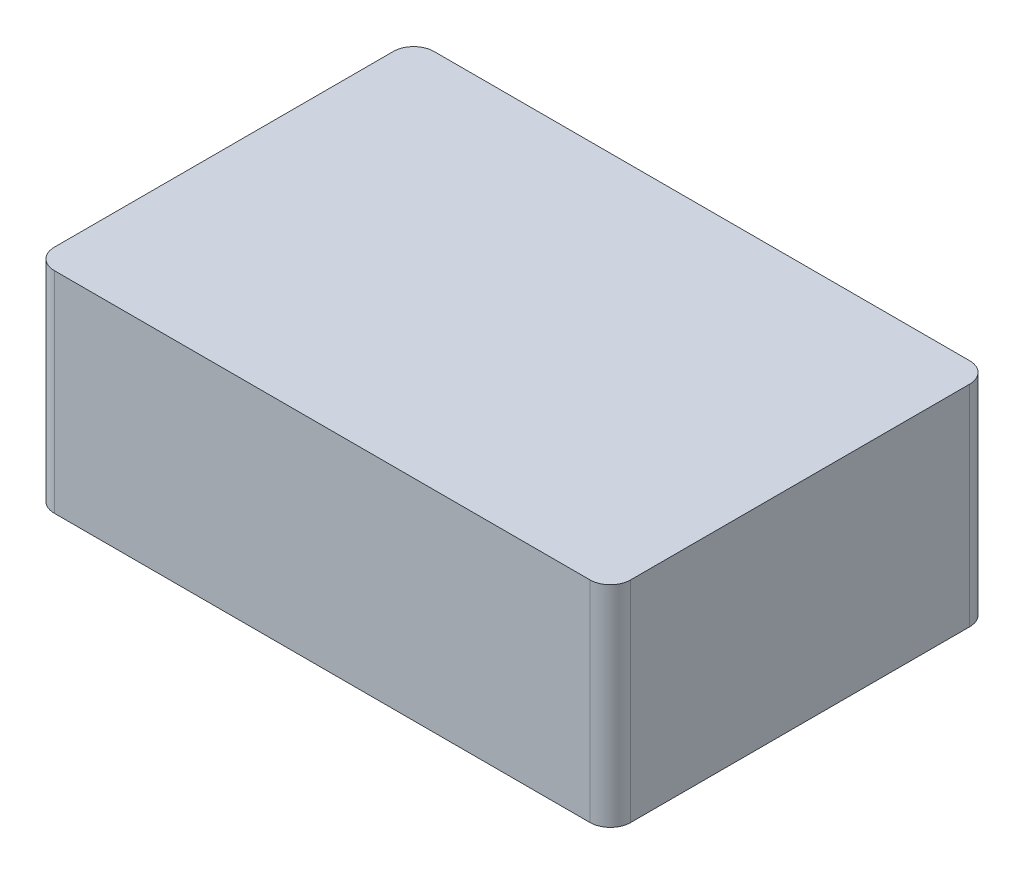
ISO-10303-21;
HEADER;
FILE_DESCRIPTION(('STEP AP214'),'2;1');
FILE_NAME('part.step','',(''),(''),'','','');
FILE_SCHEMA(('AUTOMOTIVE_DESIGN { 1 0 10303 214 1 1 1 1 }'));
ENDSEC;
DATA;
#1=APPLICATION_CONTEXT('core data for automotive mechanical design processes');
#2=APPLICATION_PROTOCOL_DEFINITION('international standard','automotive_design',2000,#1);
#3=PRODUCT_CONTEXT('',#1,'mechanical');
#4=PRODUCT('Part','Part','',(#3));
#5=PRODUCT_RELATED_PRODUCT_CATEGORY('part','',(#4));
#6=PRODUCT_DEFINITION_FORMATION('','',#4);
#7=PRODUCT_DEFINITION_CONTEXT('part definition',#1,'design');
#8=PRODUCT_DEFINITION('design','',#6,#7);
#9=PRODUCT_DEFINITION_SHAPE('','',#8);
#10=(LENGTH_UNIT() NAMED_UNIT(*) SI_UNIT(.MILLI.,.METRE.));
#11=(NAMED_UNIT(*) PLANE_ANGLE_UNIT() SI_UNIT($,.RADIAN.));
#12=(NAMED_UNIT(*) SI_UNIT($,.STERADIAN.) SOLID_ANGLE_UNIT());
#13=UNCERTAINTY_MEASURE_WITH_UNIT(LENGTH_MEASURE(1.E-05),#10,'distance_accuracy_value','');
#14=(GEOMETRIC_REPRESENTATION_CONTEXT(3) GLOBAL_UNCERTAINTY_ASSIGNED_CONTEXT((#13)) GLOBAL_UNIT_ASSIGNED_CONTEXT((#10,
#11,#12)) REPRESENTATION_CONTEXT('',''));
#15=CARTESIAN_POINT('',(0.,0.,0.));
#16=DIRECTION('',(0.,0.,1.));
#17=DIRECTION('',(1.,0.,0.));
#18=AXIS2_PLACEMENT_3D('',#15,#16,#17);
#19=CARTESIAN_POINT('',(0.,31.,0.));
#20=DIRECTION('',(1.,0.,0.));
#21=DIRECTION('',(0.,0.,-1.));
#22=AXIS2_PLACEMENT_3D('',#19,#20,#21);
#23=PLANE('',#22);
#24=DIRECTION('',(0.,0.,1.));
#25=VECTOR('',#24,1.);
#26=CARTESIAN_POINT('',(0.,31.,0.));
#27=LINE('',#26,#25);
#28=CARTESIAN_POINT('',(0.,31.,3.));
#29=VERTEX_POINT('',#28);
#30=CARTESIAN_POINT('',(0.,31.,53.));
#31=VERTEX_POINT('',#30);
#32=EDGE_CURVE('E126',#29,#31,#27,.T.);
#33=ORIENTED_EDGE('',*,*,#32,.F.);
#34=DIRECTION('',(0.,-1.,0.));
#35=VECTOR('',#34,1.);
#36=CARTESIAN_POINT('',(0.,31.,3.));
#37=LINE('',#36,#35);
#38=CARTESIAN_POINT('',(0.,0.,3.));
#39=VERTEX_POINT('',#38);
#40=EDGE_CURVE('E111',#29,#39,#37,.T.);
#41=ORIENTED_EDGE('',*,*,#40,.T.);
#42=DIRECTION('',(0.,0.,1.));
#43=VECTOR('',#42,1.);
#44=CARTESIAN_POINT('',(0.,0.,0.));
#45=LINE('',#44,#43);
#46=CARTESIAN_POINT('',(0.,0.,53.));
#47=VERTEX_POINT('',#46);
#48=EDGE_CURVE('E123',#39,#47,#45,.T.);
#49=ORIENTED_EDGE('',*,*,#48,.T.);
#50=DIRECTION('',(0.,-1.,0.));
#51=VECTOR('',#50,1.);
#52=CARTESIAN_POINT('',(0.,31.,53.));
#53=LINE('',#52,#51);
#54=EDGE_CURVE('E128',#47,#31,#53,.F.);
#55=ORIENTED_EDGE('',*,*,#54,.T.);
#56=EDGE_LOOP('',(#33,#41,#49,#55));
#57=FACE_BOUND('',#56,.T.);
#58=ADVANCED_FACE('F41',(#57),#23,.F.);
#59=CARTESIAN_POINT('',(0.,31.,56.));
#60=DIRECTION('',(0.,0.,-1.));
#61=DIRECTION('',(-1.,0.,0.));
#62=AXIS2_PLACEMENT_3D('',#59,#60,#61);
#63=PLANE('',#62);
#64=DIRECTION('',(1.,0.,0.));
#65=VECTOR('',#64,1.);
#66=CARTESIAN_POINT('',(0.,0.,56.));
#67=LINE('',#66,#65);
#68=CARTESIAN_POINT('',(3.00000000000001,0.,56.));
#69=VERTEX_POINT('',#68);
#70=CARTESIAN_POINT('',(82.,0.,56.));
#71=VERTEX_POINT('',#70);
#72=EDGE_CURVE('E132',#69,#71,#67,.T.);
#73=ORIENTED_EDGE('',*,*,#72,.T.);
#74=DIRECTION('',(0.,-1.,0.));
#75=VECTOR('',#74,1.);
#76=CARTESIAN_POINT('',(82.,31.,56.));
#77=LINE('',#76,#75);
#78=CARTESIAN_POINT('',(82.,31.,56.));
#79=VERTEX_POINT('',#78);
#80=EDGE_CURVE('E11',#71,#79,#77,.F.);
#81=ORIENTED_EDGE('',*,*,#80,.T.);
#82=DIRECTION('',(1.,0.,0.));
#83=VECTOR('',#82,1.);
#84=CARTESIAN_POINT('',(0.,31.,56.));
#85=LINE('',#84,#83);
#86=CARTESIAN_POINT('',(3.00000000000001,31.,56.));
#87=VERTEX_POINT('',#86);
#88=EDGE_CURVE('E168',#87,#79,#85,.T.);
#89=ORIENTED_EDGE('',*,*,#88,.F.);
#90=DIRECTION('',(0.,-1.,0.));
#91=VECTOR('',#90,1.);
#92=CARTESIAN_POINT('',(3.00000000000001,31.,56.));
#93=LINE('',#92,#91);
#94=EDGE_CURVE('E49',#87,#69,#93,.T.);
#95=ORIENTED_EDGE('',*,*,#94,.T.);
#96=EDGE_LOOP('',(#73,#81,#89,#95));
#97=FACE_BOUND('',#96,.T.);
#98=ADVANCED_FACE('F166',(#97),#63,.F.);
#99=CARTESIAN_POINT('',(85.,31.,0.));
#100=DIRECTION('',(-1.,0.,0.));
#101=DIRECTION('',(0.,0.,1.));
#102=AXIS2_PLACEMENT_3D('',#99,#100,#101);
#103=PLANE('',#102);
#104=DIRECTION('',(0.,0.,-1.));
#105=VECTOR('',#104,1.);
#106=CARTESIAN_POINT('',(85.,0.,0.));
#107=LINE('',#106,#105);
#108=CARTESIAN_POINT('',(85.,0.,53.));
#109=VERTEX_POINT('',#108);
#110=CARTESIAN_POINT('',(85.,0.,3.));
#111=VERTEX_POINT('',#110);
#112=EDGE_CURVE('E135',#109,#111,#107,.T.);
#113=ORIENTED_EDGE('',*,*,#112,.T.);
#114=DIRECTION('',(0.,-1.,0.));
#115=VECTOR('',#114,1.);
#116=CARTESIAN_POINT('',(85.,31.,3.));
#117=LINE('',#116,#115);
#118=CARTESIAN_POINT('',(85.,31.,3.));
#119=VERTEX_POINT('',#118);
#120=EDGE_CURVE('E56',#111,#119,#117,.F.);
#121=ORIENTED_EDGE('',*,*,#120,.T.);
#122=DIRECTION('',(0.,0.,-1.));
#123=VECTOR('',#122,1.);
#124=CARTESIAN_POINT('',(85.,31.,0.));
#125=LINE('',#124,#123);
#126=CARTESIAN_POINT('',(85.,31.,53.));
#127=VERTEX_POINT('',#126);
#128=EDGE_CURVE('E176',#127,#119,#125,.T.);
#129=ORIENTED_EDGE('',*,*,#128,.F.);
#130=DIRECTION('',(0.,-1.,0.));
#131=VECTOR('',#130,1.);
#132=CARTESIAN_POINT('',(85.,31.,53.));
#133=LINE('',#132,#131);
#134=EDGE_CURVE('E159',#127,#109,#133,.T.);
#135=ORIENTED_EDGE('',*,*,#134,.T.);
#136=EDGE_LOOP('',(#113,#121,#129,#135));
#137=FACE_BOUND('',#136,.T.);
#138=ADVANCED_FACE('F175',(#137),#103,.F.);
#139=CARTESIAN_POINT('',(0.,31.,0.));
#140=DIRECTION('',(0.,0.,1.));
#141=DIRECTION('',(1.,0.,0.));
#142=AXIS2_PLACEMENT_3D('',#139,#140,#141);
#143=PLANE('',#142);
#144=DIRECTION('',(-1.,0.,0.));
#145=VECTOR('',#144,1.);
#146=CARTESIAN_POINT('',(0.,0.,0.));
#147=LINE('',#146,#145);
#148=CARTESIAN_POINT('',(82.,0.,0.));
#149=VERTEX_POINT('',#148);
#150=CARTESIAN_POINT('',(3.,0.,0.));
#151=VERTEX_POINT('',#150);
#152=EDGE_CURVE('E142',#149,#151,#147,.T.);
#153=ORIENTED_EDGE('',*,*,#152,.T.);
#154=DIRECTION('',(0.,-1.,0.));
#155=VECTOR('',#154,1.);
#156=CARTESIAN_POINT('',(3.,31.,0.));
#157=LINE('',#156,#155);
#158=CARTESIAN_POINT('',(3.,31.,0.));
#159=VERTEX_POINT('',#158);
#160=EDGE_CURVE('E112',#151,#159,#157,.F.);
#161=ORIENTED_EDGE('',*,*,#160,.T.);
#162=DIRECTION('',(-1.,0.,0.));
#163=VECTOR('',#162,1.);
#164=CARTESIAN_POINT('',(0.,31.,0.));
#165=LINE('',#164,#163);
#166=CARTESIAN_POINT('',(82.,31.,0.));
#167=VERTEX_POINT('',#166);
#168=EDGE_CURVE('E138',#167,#159,#165,.T.);
#169=ORIENTED_EDGE('',*,*,#168,.F.);
#170=DIRECTION('',(0.,-1.,0.));
#171=VECTOR('',#170,1.);
#172=CARTESIAN_POINT('',(82.,31.,0.));
#173=LINE('',#172,#171);
#174=EDGE_CURVE('E117',#167,#149,#173,.T.);
#175=ORIENTED_EDGE('',*,*,#174,.T.);
#176=EDGE_LOOP('',(#153,#161,#169,#175));
#177=FACE_BOUND('',#176,.T.);
#178=ADVANCED_FACE('F204',(#177),#143,.F.);
#179=CARTESIAN_POINT('',(0.,31.,0.));
#180=DIRECTION('',(0.,1.,0.));
#181=DIRECTION('',(0.,0.,1.));
#182=AXIS2_PLACEMENT_3D('',#179,#180,#181);
#183=PLANE('',#182);
#184=ORIENTED_EDGE('',*,*,#168,.T.);
#185=CARTESIAN_POINT('',(3.,31.,3.));
#186=DIRECTION('',(0.,1.,0.));
#187=DIRECTION('',(0.,0.,1.));
#188=AXIS2_PLACEMENT_3D('',#185,#186,#187);
#189=CIRCLE('',#188,3.);
#190=EDGE_CURVE('E157',#159,#29,#189,.T.);
#191=ORIENTED_EDGE('',*,*,#190,.T.);
#192=ORIENTED_EDGE('',*,*,#32,.T.);
#193=CARTESIAN_POINT('',(3.00000000000001,31.,53.));
#194=DIRECTION('',(0.,1.,0.));
#195=DIRECTION('',(0.,0.,1.));
#196=AXIS2_PLACEMENT_3D('',#193,#194,#195);
#197=CIRCLE('',#196,3.);
#198=EDGE_CURVE('E152',#31,#87,#197,.T.);
#199=ORIENTED_EDGE('',*,*,#198,.T.);
#200=ORIENTED_EDGE('',*,*,#88,.T.);
#201=CARTESIAN_POINT('',(82.,31.,53.));
#202=DIRECTION('',(0.,1.,0.));
#203=DIRECTION('',(0.,0.,1.));
#204=AXIS2_PLACEMENT_3D('',#201,#202,#203);
#205=CIRCLE('',#204,3.);
#206=EDGE_CURVE('E63',#79,#127,#205,.T.);
#207=ORIENTED_EDGE('',*,*,#206,.T.);
#208=ORIENTED_EDGE('',*,*,#128,.T.);
#209=CARTESIAN_POINT('',(82.,31.,3.));
#210=DIRECTION('',(0.,1.,0.));
#211=DIRECTION('',(0.,0.,1.));
#212=AXIS2_PLACEMENT_3D('',#209,#210,#211);
#213=CIRCLE('',#212,3.);
#214=EDGE_CURVE('E155',#119,#167,#213,.T.);
#215=ORIENTED_EDGE('',*,*,#214,.T.);
#216=EDGE_LOOP('',(#184,#191,#192,#199,#200,#207,#208,#215));
#217=FACE_BOUND('',#216,.T.);
#218=ADVANCED_FACE('F181',(#217),#183,.T.);
#219=CARTESIAN_POINT('',(0.,0.,0.));
#220=DIRECTION('',(0.,1.,0.));
#221=DIRECTION('',(0.,0.,1.));
#222=AXIS2_PLACEMENT_3D('',#219,#220,#221);
#223=PLANE('',#222);
#224=ORIENTED_EDGE('',*,*,#48,.F.);
#225=CARTESIAN_POINT('',(3.,0.,3.));
#226=DIRECTION('',(0.,1.,0.));
#227=DIRECTION('',(0.,0.,1.));
#228=AXIS2_PLACEMENT_3D('',#225,#226,#227);
#229=CIRCLE('',#228,3.);
#230=EDGE_CURVE('E107',#39,#151,#229,.F.);
#231=ORIENTED_EDGE('',*,*,#230,.T.);
#232=ORIENTED_EDGE('',*,*,#152,.F.);
#233=CARTESIAN_POINT('',(82.,0.,3.));
#234=DIRECTION('',(0.,1.,0.));
#235=DIRECTION('',(0.,0.,1.));
#236=AXIS2_PLACEMENT_3D('',#233,#234,#235);
#237=CIRCLE('',#236,3.);
#238=EDGE_CURVE('E118',#149,#111,#237,.F.);
#239=ORIENTED_EDGE('',*,*,#238,.T.);
#240=ORIENTED_EDGE('',*,*,#112,.F.);
#241=CARTESIAN_POINT('',(82.,0.,53.));
#242=DIRECTION('',(0.,1.,0.));
#243=DIRECTION('',(0.,0.,1.));
#244=AXIS2_PLACEMENT_3D('',#241,#242,#243);
#245=CIRCLE('',#244,3.);
#246=EDGE_CURVE('E146',#109,#71,#245,.F.);
#247=ORIENTED_EDGE('',*,*,#246,.T.);
#248=ORIENTED_EDGE('',*,*,#72,.F.);
#249=CARTESIAN_POINT('',(3.00000000000001,0.,53.));
#250=DIRECTION('',(0.,1.,0.));
#251=DIRECTION('',(0.,0.,1.));
#252=AXIS2_PLACEMENT_3D('',#249,#250,#251);
#253=CIRCLE('',#252,3.);
#254=EDGE_CURVE('E127',#69,#47,#253,.F.);
#255=ORIENTED_EDGE('',*,*,#254,.T.);
#256=EDGE_LOOP('',(#224,#231,#232,#239,#240,#247,#248,#255));
#257=FACE_BOUND('',#256,.T.);
#258=ADVANCED_FACE('F130',(#257),#223,.F.);
#259=CARTESIAN_POINT('',(3.,31.,3.));
#260=DIRECTION('',(0.,-1.,0.));
#261=DIRECTION('',(0.,0.,-1.));
#262=AXIS2_PLACEMENT_3D('',#259,#260,#261);
#263=CYLINDRICAL_SURFACE('',#262,3.);
#264=ORIENTED_EDGE('',*,*,#190,.F.);
#265=ORIENTED_EDGE('',*,*,#160,.F.);
#266=ORIENTED_EDGE('',*,*,#230,.F.);
#267=ORIENTED_EDGE('',*,*,#40,.F.);
#268=EDGE_LOOP('',(#264,#265,#266,#267));
#269=FACE_BOUND('',#268,.T.);
#270=ADVANCED_FACE('F110',(#269),#263,.T.);
#271=CARTESIAN_POINT('',(82.,31.,3.));
#272=DIRECTION('',(0.,-1.,0.));
#273=DIRECTION('',(0.,0.,-1.));
#274=AXIS2_PLACEMENT_3D('',#271,#272,#273);
#275=CYLINDRICAL_SURFACE('',#274,3.);
#276=ORIENTED_EDGE('',*,*,#214,.F.);
#277=ORIENTED_EDGE('',*,*,#120,.F.);
#278=ORIENTED_EDGE('',*,*,#238,.F.);
#279=ORIENTED_EDGE('',*,*,#174,.F.);
#280=EDGE_LOOP('',(#276,#277,#278,#279));
#281=FACE_BOUND('',#280,.T.);
#282=ADVANCED_FACE('F186',(#281),#275,.T.);
#283=CARTESIAN_POINT('',(82.,31.,53.));
#284=DIRECTION('',(0.,-1.,0.));
#285=DIRECTION('',(0.,0.,-1.));
#286=AXIS2_PLACEMENT_3D('',#283,#284,#285);
#287=CYLINDRICAL_SURFACE('',#286,3.);
#288=ORIENTED_EDGE('',*,*,#206,.F.);
#289=ORIENTED_EDGE('',*,*,#80,.F.);
#290=ORIENTED_EDGE('',*,*,#246,.F.);
#291=ORIENTED_EDGE('',*,*,#134,.F.);
#292=EDGE_LOOP('',(#288,#289,#290,#291));
#293=FACE_BOUND('',#292,.T.);
#294=ADVANCED_FACE('F174',(#293),#287,.T.);
#295=CARTESIAN_POINT('',(3.00000000000001,31.,53.));
#296=DIRECTION('',(0.,-1.,0.));
#297=DIRECTION('',(0.,0.,-1.));
#298=AXIS2_PLACEMENT_3D('',#295,#296,#297);
#299=CYLINDRICAL_SURFACE('',#298,3.);
#300=ORIENTED_EDGE('',*,*,#198,.F.);
#301=ORIENTED_EDGE('',*,*,#54,.F.);
#302=ORIENTED_EDGE('',*,*,#254,.F.);
#303=ORIENTED_EDGE('',*,*,#94,.F.);
#304=EDGE_LOOP('',(#300,#301,#302,#303));
#305=FACE_BOUND('',#304,.T.);
#306=ADVANCED_FACE('F43',(#305),#299,.T.);
#307=CLOSED_SHELL('',(#58,#98,#138,#178,#218,#258,#270,#282,#294,#306));
#308=MANIFOLD_SOLID_BREP('B2',#307);
#309=ADVANCED_BREP_SHAPE_REPRESENTATION('',(#18,#308),#14);
#310=SHAPE_DEFINITION_REPRESENTATION(#9,#309);
ENDSEC;
END-ISO-10303-21;
